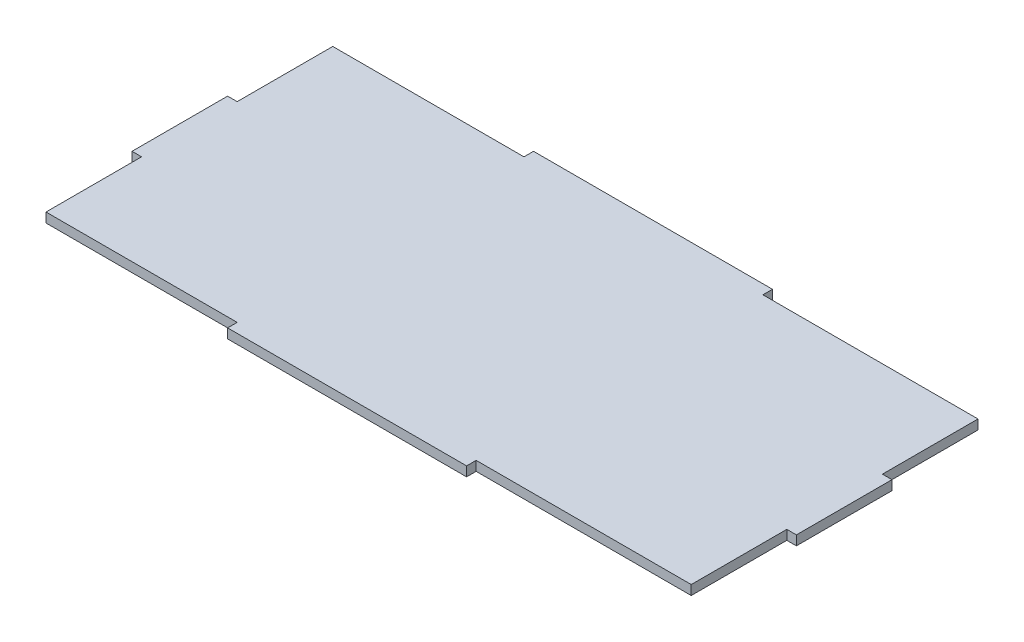
ISO-10303-21;
HEADER;
FILE_DESCRIPTION(('STEP AP214'),'2;1');
FILE_NAME('part.step','',(''),(''),'','','');
FILE_SCHEMA(('AUTOMOTIVE_DESIGN { 1 0 10303 214 1 1 1 1 }'));
ENDSEC;
DATA;
#1=APPLICATION_CONTEXT('core data for automotive mechanical design processes');
#2=APPLICATION_PROTOCOL_DEFINITION('international standard','automotive_design',2000,#1);
#3=PRODUCT_CONTEXT('',#1,'mechanical');
#4=PRODUCT('Part','Part','',(#3));
#5=PRODUCT_RELATED_PRODUCT_CATEGORY('part','',(#4));
#6=PRODUCT_DEFINITION_FORMATION('','',#4);
#7=PRODUCT_DEFINITION_CONTEXT('part definition',#1,'design');
#8=PRODUCT_DEFINITION('design','',#6,#7);
#9=PRODUCT_DEFINITION_SHAPE('','',#8);
#10=(LENGTH_UNIT() NAMED_UNIT(*) SI_UNIT(.MILLI.,.METRE.));
#11=(NAMED_UNIT(*) PLANE_ANGLE_UNIT() SI_UNIT($,.RADIAN.));
#12=(NAMED_UNIT(*) SI_UNIT($,.STERADIAN.) SOLID_ANGLE_UNIT());
#13=UNCERTAINTY_MEASURE_WITH_UNIT(LENGTH_MEASURE(1.E-05),#10,'distance_accuracy_value','');
#14=(GEOMETRIC_REPRESENTATION_CONTEXT(3) GLOBAL_UNCERTAINTY_ASSIGNED_CONTEXT((#13)) GLOBAL_UNIT_ASSIGNED_CONTEXT((#10,
#11,#12)) REPRESENTATION_CONTEXT('',''));
#15=CARTESIAN_POINT('',(0.,0.,0.));
#16=DIRECTION('',(0.,0.,1.));
#17=DIRECTION('',(1.,0.,0.));
#18=AXIS2_PLACEMENT_3D('',#15,#16,#17);
#19=CARTESIAN_POINT('',(-2.,2.,0.));
#20=DIRECTION('',(1.,0.,0.));
#21=DIRECTION('',(0.,0.,-1.));
#22=AXIS2_PLACEMENT_3D('',#19,#20,#21);
#23=PLANE('',#22);
#24=DIRECTION('',(0.,0.,1.));
#25=VECTOR('',#24,1.);
#26=CARTESIAN_POINT('',(-2.,0.,0.));
#27=LINE('',#26,#25);
#28=CARTESIAN_POINT('',(-2.,0.,-10.));
#29=VERTEX_POINT('',#28);
#30=CARTESIAN_POINT('',(-2.,0.,9.99999999999999));
#31=VERTEX_POINT('',#30);
#32=EDGE_CURVE('E353',#29,#31,#27,.T.);
#33=ORIENTED_EDGE('',*,*,#32,.T.);
#34=DIRECTION('',(0.,-1.,0.));
#35=VECTOR('',#34,1.);
#36=CARTESIAN_POINT('',(-2.,2.,9.99999999999999));
#37=LINE('',#36,#35);
#38=CARTESIAN_POINT('',(-2.,2.,9.99999999999999));
#39=VERTEX_POINT('',#38);
#40=EDGE_CURVE('E11',#39,#31,#37,.T.);
#41=ORIENTED_EDGE('',*,*,#40,.F.);
#42=DIRECTION('',(0.,0.,1.));
#43=VECTOR('',#42,1.);
#44=CARTESIAN_POINT('',(-2.,2.,0.));
#45=LINE('',#44,#43);
#46=CARTESIAN_POINT('',(-2.,2.,-10.));
#47=VERTEX_POINT('',#46);
#48=EDGE_CURVE('E269',#47,#39,#45,.T.);
#49=ORIENTED_EDGE('',*,*,#48,.F.);
#50=DIRECTION('',(0.,-1.,0.));
#51=VECTOR('',#50,1.);
#52=CARTESIAN_POINT('',(-2.,2.,-10.));
#53=LINE('',#52,#51);
#54=EDGE_CURVE('E62',#47,#29,#53,.T.);
#55=ORIENTED_EDGE('',*,*,#54,.T.);
#56=EDGE_LOOP('',(#33,#41,#49,#55));
#57=FACE_BOUND('',#56,.T.);
#58=ADVANCED_FACE('F45',(#57),#23,.F.);
#59=CARTESIAN_POINT('',(0.,2.,9.99999999999999));
#60=DIRECTION('',(0.,0.,-1.));
#61=DIRECTION('',(-1.,0.,0.));
#62=AXIS2_PLACEMENT_3D('',#59,#60,#61);
#63=PLANE('',#62);
#64=DIRECTION('',(1.,0.,0.));
#65=VECTOR('',#64,1.);
#66=CARTESIAN_POINT('',(0.,0.,9.99999999999999));
#67=LINE('',#66,#65);
#68=CARTESIAN_POINT('',(0.,0.,9.99999999999999));
#69=VERTEX_POINT('',#68);
#70=EDGE_CURVE('E344',#31,#69,#67,.T.);
#71=ORIENTED_EDGE('',*,*,#70,.T.);
#72=DIRECTION('',(0.,-1.,0.));
#73=VECTOR('',#72,1.);
#74=CARTESIAN_POINT('',(0.,2.,9.99999999999999));
#75=LINE('',#74,#73);
#76=CARTESIAN_POINT('',(0.,2.,9.99999999999999));
#77=VERTEX_POINT('',#76);
#78=EDGE_CURVE('E54',#77,#69,#75,.T.);
#79=ORIENTED_EDGE('',*,*,#78,.F.);
#80=DIRECTION('',(1.,0.,0.));
#81=VECTOR('',#80,1.);
#82=CARTESIAN_POINT('',(0.,2.,9.99999999999999));
#83=LINE('',#82,#81);
#84=EDGE_CURVE('E137',#39,#77,#83,.T.);
#85=ORIENTED_EDGE('',*,*,#84,.F.);
#86=ORIENTED_EDGE('',*,*,#40,.T.);
#87=EDGE_LOOP('',(#71,#79,#85,#86));
#88=FACE_BOUND('',#87,.T.);
#89=ADVANCED_FACE('F446',(#88),#63,.F.);
#90=CARTESIAN_POINT('',(0.,2.,0.));
#91=DIRECTION('',(1.,0.,0.));
#92=DIRECTION('',(0.,0.,-1.));
#93=AXIS2_PLACEMENT_3D('',#90,#91,#92);
#94=PLANE('',#93);
#95=DIRECTION('',(0.,0.,1.));
#96=VECTOR('',#95,1.);
#97=CARTESIAN_POINT('',(0.,0.,0.));
#98=LINE('',#97,#96);
#99=CARTESIAN_POINT('',(0.,0.,30.));
#100=VERTEX_POINT('',#99);
#101=EDGE_CURVE('E282',#69,#100,#98,.T.);
#102=ORIENTED_EDGE('',*,*,#101,.T.);
#103=DIRECTION('',(0.,-1.,0.));
#104=VECTOR('',#103,1.);
#105=CARTESIAN_POINT('',(0.,2.,30.));
#106=LINE('',#105,#104);
#107=CARTESIAN_POINT('',(0.,2.,30.));
#108=VERTEX_POINT('',#107);
#109=EDGE_CURVE('E334',#108,#100,#106,.T.);
#110=ORIENTED_EDGE('',*,*,#109,.F.);
#111=DIRECTION('',(0.,0.,1.));
#112=VECTOR('',#111,1.);
#113=CARTESIAN_POINT('',(0.,2.,0.));
#114=LINE('',#113,#112);
#115=EDGE_CURVE('E208',#77,#108,#114,.T.);
#116=ORIENTED_EDGE('',*,*,#115,.F.);
#117=ORIENTED_EDGE('',*,*,#78,.T.);
#118=EDGE_LOOP('',(#102,#110,#116,#117));
#119=FACE_BOUND('',#118,.T.);
#120=ADVANCED_FACE('F341',(#119),#94,.F.);
#121=CARTESIAN_POINT('',(0.,2.,30.));
#122=DIRECTION('',(0.,0.,-1.));
#123=DIRECTION('',(-1.,0.,0.));
#124=AXIS2_PLACEMENT_3D('',#121,#122,#123);
#125=PLANE('',#124);
#126=DIRECTION('',(1.,0.,0.));
#127=VECTOR('',#126,1.);
#128=CARTESIAN_POINT('',(0.,0.,30.));
#129=LINE('',#128,#127);
#130=CARTESIAN_POINT('',(40.,0.,30.));
#131=VERTEX_POINT('',#130);
#132=EDGE_CURVE('E346',#100,#131,#129,.T.);
#133=ORIENTED_EDGE('',*,*,#132,.T.);
#134=DIRECTION('',(0.,-1.,0.));
#135=VECTOR('',#134,1.);
#136=CARTESIAN_POINT('',(40.,2.,30.));
#137=LINE('',#136,#135);
#138=CARTESIAN_POINT('',(40.,2.,30.));
#139=VERTEX_POINT('',#138);
#140=EDGE_CURVE('E330',#139,#131,#137,.T.);
#141=ORIENTED_EDGE('',*,*,#140,.F.);
#142=DIRECTION('',(1.,0.,0.));
#143=VECTOR('',#142,1.);
#144=CARTESIAN_POINT('',(0.,2.,30.));
#145=LINE('',#144,#143);
#146=EDGE_CURVE('E252',#108,#139,#145,.T.);
#147=ORIENTED_EDGE('',*,*,#146,.F.);
#148=ORIENTED_EDGE('',*,*,#109,.T.);
#149=EDGE_LOOP('',(#133,#141,#147,#148));
#150=FACE_BOUND('',#149,.T.);
#151=ADVANCED_FACE('F485',(#150),#125,.F.);
#152=CARTESIAN_POINT('',(40.,2.,0.));
#153=DIRECTION('',(1.,0.,0.));
#154=DIRECTION('',(0.,0.,-1.));
#155=AXIS2_PLACEMENT_3D('',#152,#153,#154);
#156=PLANE('',#155);
#157=DIRECTION('',(0.,0.,1.));
#158=VECTOR('',#157,1.);
#159=CARTESIAN_POINT('',(40.,0.,0.));
#160=LINE('',#159,#158);
#161=CARTESIAN_POINT('',(40.,0.,32.));
#162=VERTEX_POINT('',#161);
#163=EDGE_CURVE('E350',#131,#162,#160,.T.);
#164=ORIENTED_EDGE('',*,*,#163,.T.);
#165=DIRECTION('',(0.,-1.,0.));
#166=VECTOR('',#165,1.);
#167=CARTESIAN_POINT('',(40.,2.,32.));
#168=LINE('',#167,#166);
#169=CARTESIAN_POINT('',(40.,2.,32.));
#170=VERTEX_POINT('',#169);
#171=EDGE_CURVE('E326',#170,#162,#168,.T.);
#172=ORIENTED_EDGE('',*,*,#171,.F.);
#173=DIRECTION('',(0.,0.,1.));
#174=VECTOR('',#173,1.);
#175=CARTESIAN_POINT('',(40.,2.,0.));
#176=LINE('',#175,#174);
#177=EDGE_CURVE('E261',#139,#170,#176,.T.);
#178=ORIENTED_EDGE('',*,*,#177,.F.);
#179=ORIENTED_EDGE('',*,*,#140,.T.);
#180=EDGE_LOOP('',(#164,#172,#178,#179));
#181=FACE_BOUND('',#180,.T.);
#182=ADVANCED_FACE('F493',(#181),#156,.F.);
#183=CARTESIAN_POINT('',(0.,2.,32.));
#184=DIRECTION('',(0.,0.,-1.));
#185=DIRECTION('',(-1.,0.,0.));
#186=AXIS2_PLACEMENT_3D('',#183,#184,#185);
#187=PLANE('',#186);
#188=DIRECTION('',(1.,0.,0.));
#189=VECTOR('',#188,1.);
#190=CARTESIAN_POINT('',(0.,0.,32.));
#191=LINE('',#190,#189);
#192=CARTESIAN_POINT('',(90.,0.,32.));
#193=VERTEX_POINT('',#192);
#194=EDGE_CURVE('E359',#162,#193,#191,.T.);
#195=ORIENTED_EDGE('',*,*,#194,.T.);
#196=DIRECTION('',(0.,-1.,0.));
#197=VECTOR('',#196,1.);
#198=CARTESIAN_POINT('',(90.,2.,32.));
#199=LINE('',#198,#197);
#200=CARTESIAN_POINT('',(90.,2.,32.));
#201=VERTEX_POINT('',#200);
#202=EDGE_CURVE('E323',#201,#193,#199,.T.);
#203=ORIENTED_EDGE('',*,*,#202,.F.);
#204=DIRECTION('',(1.,0.,0.));
#205=VECTOR('',#204,1.);
#206=CARTESIAN_POINT('',(0.,2.,32.));
#207=LINE('',#206,#205);
#208=EDGE_CURVE('E258',#170,#201,#207,.T.);
#209=ORIENTED_EDGE('',*,*,#208,.F.);
#210=ORIENTED_EDGE('',*,*,#171,.T.);
#211=EDGE_LOOP('',(#195,#203,#209,#210));
#212=FACE_BOUND('',#211,.T.);
#213=ADVANCED_FACE('F489',(#212),#187,.F.);
#214=CARTESIAN_POINT('',(90.,2.,0.));
#215=DIRECTION('',(1.,0.,0.));
#216=DIRECTION('',(0.,0.,-1.));
#217=AXIS2_PLACEMENT_3D('',#214,#215,#216);
#218=PLANE('',#217);
#219=DIRECTION('',(0.,0.,1.));
#220=VECTOR('',#219,1.);
#221=CARTESIAN_POINT('',(90.,0.,0.));
#222=LINE('',#221,#220);
#223=CARTESIAN_POINT('',(90.,0.,30.));
#224=VERTEX_POINT('',#223);
#225=EDGE_CURVE('E363',#224,#193,#222,.T.);
#226=ORIENTED_EDGE('',*,*,#225,.F.);
#227=DIRECTION('',(0.,-1.,0.));
#228=VECTOR('',#227,1.);
#229=CARTESIAN_POINT('',(90.,2.,30.));
#230=LINE('',#229,#228);
#231=CARTESIAN_POINT('',(90.,2.,30.));
#232=VERTEX_POINT('',#231);
#233=EDGE_CURVE('E320',#232,#224,#230,.T.);
#234=ORIENTED_EDGE('',*,*,#233,.F.);
#235=DIRECTION('',(0.,0.,1.));
#236=VECTOR('',#235,1.);
#237=CARTESIAN_POINT('',(90.,2.,0.));
#238=LINE('',#237,#236);
#239=EDGE_CURVE('E250',#232,#201,#238,.T.);
#240=ORIENTED_EDGE('',*,*,#239,.T.);
#241=ORIENTED_EDGE('',*,*,#202,.T.);
#242=EDGE_LOOP('',(#226,#234,#240,#241));
#243=FACE_BOUND('',#242,.T.);
#244=ADVANCED_FACE('F483',(#243),#218,.T.);
#245=CARTESIAN_POINT('',(135.,0.,30.));
#246=VERTEX_POINT('',#245);
#247=EDGE_CURVE('E352',#224,#246,#129,.T.);
#248=ORIENTED_EDGE('',*,*,#247,.T.);
#249=DIRECTION('',(0.,-1.,0.));
#250=VECTOR('',#249,1.);
#251=CARTESIAN_POINT('',(135.,2.,30.));
#252=LINE('',#251,#250);
#253=CARTESIAN_POINT('',(135.,2.,30.));
#254=VERTEX_POINT('',#253);
#255=EDGE_CURVE('E317',#254,#246,#252,.T.);
#256=ORIENTED_EDGE('',*,*,#255,.F.);
#257=EDGE_CURVE('E245',#232,#254,#145,.T.);
#258=ORIENTED_EDGE('',*,*,#257,.F.);
#259=ORIENTED_EDGE('',*,*,#233,.T.);
#260=EDGE_LOOP('',(#248,#256,#258,#259));
#261=FACE_BOUND('',#260,.T.);
#262=ADVANCED_FACE('F418',(#261),#125,.F.);
#263=CARTESIAN_POINT('',(135.,2.,0.));
#264=DIRECTION('',(1.,0.,0.));
#265=DIRECTION('',(0.,0.,-1.));
#266=AXIS2_PLACEMENT_3D('',#263,#264,#265);
#267=PLANE('',#266);
#268=DIRECTION('',(0.,0.,1.));
#269=VECTOR('',#268,1.);
#270=CARTESIAN_POINT('',(135.,0.,0.));
#271=LINE('',#270,#269);
#272=CARTESIAN_POINT('',(135.,0.,10.));
#273=VERTEX_POINT('',#272);
#274=EDGE_CURVE('E367',#273,#246,#271,.T.);
#275=ORIENTED_EDGE('',*,*,#274,.F.);
#276=DIRECTION('',(0.,-1.,0.));
#277=VECTOR('',#276,1.);
#278=CARTESIAN_POINT('',(135.,2.,10.));
#279=LINE('',#278,#277);
#280=CARTESIAN_POINT('',(135.,2.,10.));
#281=VERTEX_POINT('',#280);
#282=EDGE_CURVE('E314',#281,#273,#279,.T.);
#283=ORIENTED_EDGE('',*,*,#282,.F.);
#284=DIRECTION('',(0.,0.,1.));
#285=VECTOR('',#284,1.);
#286=CARTESIAN_POINT('',(135.,2.,0.));
#287=LINE('',#286,#285);
#288=EDGE_CURVE('E234',#281,#254,#287,.T.);
#289=ORIENTED_EDGE('',*,*,#288,.T.);
#290=ORIENTED_EDGE('',*,*,#255,.T.);
#291=EDGE_LOOP('',(#275,#283,#289,#290));
#292=FACE_BOUND('',#291,.T.);
#293=ADVANCED_FACE('F422',(#292),#267,.T.);
#294=CARTESIAN_POINT('',(0.,2.,10.));
#295=DIRECTION('',(0.,0.,-1.));
#296=DIRECTION('',(-1.,0.,0.));
#297=AXIS2_PLACEMENT_3D('',#294,#295,#296);
#298=PLANE('',#297);
#299=DIRECTION('',(1.,0.,0.));
#300=VECTOR('',#299,1.);
#301=CARTESIAN_POINT('',(0.,0.,10.));
#302=LINE('',#301,#300);
#303=CARTESIAN_POINT('',(137.,0.,10.));
#304=VERTEX_POINT('',#303);
#305=EDGE_CURVE('E371',#273,#304,#302,.T.);
#306=ORIENTED_EDGE('',*,*,#305,.T.);
#307=DIRECTION('',(0.,-1.,0.));
#308=VECTOR('',#307,1.);
#309=CARTESIAN_POINT('',(137.,2.,10.));
#310=LINE('',#309,#308);
#311=CARTESIAN_POINT('',(137.,2.,10.));
#312=VERTEX_POINT('',#311);
#313=EDGE_CURVE('E311',#312,#304,#310,.T.);
#314=ORIENTED_EDGE('',*,*,#313,.F.);
#315=DIRECTION('',(1.,0.,0.));
#316=VECTOR('',#315,1.);
#317=CARTESIAN_POINT('',(0.,2.,10.));
#318=LINE('',#317,#316);
#319=EDGE_CURVE('E244',#281,#312,#318,.T.);
#320=ORIENTED_EDGE('',*,*,#319,.F.);
#321=ORIENTED_EDGE('',*,*,#282,.T.);
#322=EDGE_LOOP('',(#306,#314,#320,#321));
#323=FACE_BOUND('',#322,.T.);
#324=ADVANCED_FACE('F426',(#323),#298,.F.);
#325=CARTESIAN_POINT('',(137.,2.,-1.90125692967058E-13));
#326=DIRECTION('',(1.,0.,0.));
#327=DIRECTION('',(0.,0.,-1.));
#328=AXIS2_PLACEMENT_3D('',#325,#326,#327);
#329=PLANE('',#328);
#330=DIRECTION('',(0.,0.,1.));
#331=VECTOR('',#330,1.);
#332=CARTESIAN_POINT('',(137.,0.,-1.90125692967058E-13));
#333=LINE('',#332,#331);
#334=CARTESIAN_POINT('',(137.,0.,-10.));
#335=VERTEX_POINT('',#334);
#336=EDGE_CURVE('E376',#335,#304,#333,.T.);
#337=ORIENTED_EDGE('',*,*,#336,.F.);
#338=DIRECTION('',(0.,-1.,0.));
#339=VECTOR('',#338,1.);
#340=CARTESIAN_POINT('',(137.,2.,-10.));
#341=LINE('',#340,#339);
#342=CARTESIAN_POINT('',(137.,2.,-10.));
#343=VERTEX_POINT('',#342);
#344=EDGE_CURVE('E308',#343,#335,#341,.T.);
#345=ORIENTED_EDGE('',*,*,#344,.F.);
#346=DIRECTION('',(0.,0.,1.));
#347=VECTOR('',#346,1.);
#348=CARTESIAN_POINT('',(137.,2.,-1.90125692967058E-13));
#349=LINE('',#348,#347);
#350=EDGE_CURVE('E239',#343,#312,#349,.T.);
#351=ORIENTED_EDGE('',*,*,#350,.T.);
#352=ORIENTED_EDGE('',*,*,#313,.T.);
#353=EDGE_LOOP('',(#337,#345,#351,#352));
#354=FACE_BOUND('',#353,.T.);
#355=ADVANCED_FACE('F436',(#354),#329,.T.);
#356=CARTESIAN_POINT('',(0.,2.,-9.99999999999988));
#357=DIRECTION('',(0.,0.,-1.));
#358=DIRECTION('',(-1.,0.,0.));
#359=AXIS2_PLACEMENT_3D('',#356,#357,#358);
#360=PLANE('',#359);
#361=DIRECTION('',(1.,0.,0.));
#362=VECTOR('',#361,1.);
#363=CARTESIAN_POINT('',(0.,0.,-9.99999999999988));
#364=LINE('',#363,#362);
#365=CARTESIAN_POINT('',(135.,0.,-10.));
#366=VERTEX_POINT('',#365);
#367=EDGE_CURVE('E380',#366,#335,#364,.T.);
#368=ORIENTED_EDGE('',*,*,#367,.F.);
#369=DIRECTION('',(0.,-1.,0.));
#370=VECTOR('',#369,1.);
#371=CARTESIAN_POINT('',(135.,2.,-10.));
#372=LINE('',#371,#370);
#373=CARTESIAN_POINT('',(135.,2.,-10.));
#374=VERTEX_POINT('',#373);
#375=EDGE_CURVE('E305',#374,#366,#372,.T.);
#376=ORIENTED_EDGE('',*,*,#375,.F.);
#377=DIRECTION('',(1.,0.,0.));
#378=VECTOR('',#377,1.);
#379=CARTESIAN_POINT('',(0.,2.,-9.99999999999988));
#380=LINE('',#379,#378);
#381=EDGE_CURVE('E232',#374,#343,#380,.T.);
#382=ORIENTED_EDGE('',*,*,#381,.T.);
#383=ORIENTED_EDGE('',*,*,#344,.T.);
#384=EDGE_LOOP('',(#368,#376,#382,#383));
#385=FACE_BOUND('',#384,.T.);
#386=ADVANCED_FACE('F434',(#385),#360,.T.);
#387=CARTESIAN_POINT('',(135.,0.,-30.));
#388=VERTEX_POINT('',#387);
#389=EDGE_CURVE('E372',#388,#366,#271,.T.);
#390=ORIENTED_EDGE('',*,*,#389,.F.);
#391=DIRECTION('',(0.,-1.,0.));
#392=VECTOR('',#391,1.);
#393=CARTESIAN_POINT('',(135.,2.,-30.));
#394=LINE('',#393,#392);
#395=CARTESIAN_POINT('',(135.,2.,-30.));
#396=VERTEX_POINT('',#395);
#397=EDGE_CURVE('E302',#396,#388,#394,.T.);
#398=ORIENTED_EDGE('',*,*,#397,.F.);
#399=EDGE_CURVE('E225',#396,#374,#287,.T.);
#400=ORIENTED_EDGE('',*,*,#399,.T.);
#401=ORIENTED_EDGE('',*,*,#375,.T.);
#402=EDGE_LOOP('',(#390,#398,#400,#401));
#403=FACE_BOUND('',#402,.T.);
#404=ADVANCED_FACE('F411',(#403),#267,.T.);
#405=CARTESIAN_POINT('',(0.,2.,-30.));
#406=DIRECTION('',(0.,0.,-1.));
#407=DIRECTION('',(-1.,0.,0.));
#408=AXIS2_PLACEMENT_3D('',#405,#406,#407);
#409=PLANE('',#408);
#410=DIRECTION('',(1.,0.,0.));
#411=VECTOR('',#410,1.);
#412=CARTESIAN_POINT('',(0.,0.,-30.));
#413=LINE('',#412,#411);
#414=CARTESIAN_POINT('',(90.,0.,-30.));
#415=VERTEX_POINT('',#414);
#416=EDGE_CURVE('E384',#415,#388,#413,.T.);
#417=ORIENTED_EDGE('',*,*,#416,.F.);
#418=DIRECTION('',(0.,-1.,0.));
#419=VECTOR('',#418,1.);
#420=CARTESIAN_POINT('',(90.,2.,-30.));
#421=LINE('',#420,#419);
#422=CARTESIAN_POINT('',(90.,2.,-30.));
#423=VERTEX_POINT('',#422);
#424=EDGE_CURVE('E299',#423,#415,#421,.T.);
#425=ORIENTED_EDGE('',*,*,#424,.F.);
#426=DIRECTION('',(1.,0.,0.));
#427=VECTOR('',#426,1.);
#428=CARTESIAN_POINT('',(0.,2.,-30.));
#429=LINE('',#428,#427);
#430=EDGE_CURVE('E216',#423,#396,#429,.T.);
#431=ORIENTED_EDGE('',*,*,#430,.T.);
#432=ORIENTED_EDGE('',*,*,#397,.T.);
#433=EDGE_LOOP('',(#417,#425,#431,#432));
#434=FACE_BOUND('',#433,.T.);
#435=ADVANCED_FACE('F410',(#434),#409,.T.);
#436=CARTESIAN_POINT('',(90.,2.,0.));
#437=DIRECTION('',(1.,0.,0.));
#438=DIRECTION('',(0.,0.,-1.));
#439=AXIS2_PLACEMENT_3D('',#436,#437,#438);
#440=PLANE('',#439);
#441=DIRECTION('',(0.,0.,1.));
#442=VECTOR('',#441,1.);
#443=CARTESIAN_POINT('',(90.,0.,0.));
#444=LINE('',#443,#442);
#445=CARTESIAN_POINT('',(90.,0.,-32.));
#446=VERTEX_POINT('',#445);
#447=EDGE_CURVE('E388',#446,#415,#444,.T.);
#448=ORIENTED_EDGE('',*,*,#447,.F.);
#449=DIRECTION('',(0.,-1.,0.));
#450=VECTOR('',#449,1.);
#451=CARTESIAN_POINT('',(90.,2.,-32.));
#452=LINE('',#451,#450);
#453=CARTESIAN_POINT('',(90.,2.,-32.));
#454=VERTEX_POINT('',#453);
#455=EDGE_CURVE('E296',#454,#446,#452,.T.);
#456=ORIENTED_EDGE('',*,*,#455,.F.);
#457=DIRECTION('',(0.,0.,1.));
#458=VECTOR('',#457,1.);
#459=CARTESIAN_POINT('',(90.,2.,0.));
#460=LINE('',#459,#458);
#461=EDGE_CURVE('E224',#454,#423,#460,.T.);
#462=ORIENTED_EDGE('',*,*,#461,.T.);
#463=ORIENTED_EDGE('',*,*,#424,.T.);
#464=EDGE_LOOP('',(#448,#456,#462,#463));
#465=FACE_BOUND('',#464,.T.);
#466=ADVANCED_FACE('F406',(#465),#440,.T.);
#467=CARTESIAN_POINT('',(0.,2.,-32.));
#468=DIRECTION('',(0.,0.,-1.));
#469=DIRECTION('',(-1.,0.,0.));
#470=AXIS2_PLACEMENT_3D('',#467,#468,#469);
#471=PLANE('',#470);
#472=DIRECTION('',(1.,0.,0.));
#473=VECTOR('',#472,1.);
#474=CARTESIAN_POINT('',(0.,0.,-32.));
#475=LINE('',#474,#473);
#476=CARTESIAN_POINT('',(40.,0.,-32.));
#477=VERTEX_POINT('',#476);
#478=EDGE_CURVE('E391',#477,#446,#475,.T.);
#479=ORIENTED_EDGE('',*,*,#478,.F.);
#480=DIRECTION('',(0.,-1.,0.));
#481=VECTOR('',#480,1.);
#482=CARTESIAN_POINT('',(40.,2.,-32.));
#483=LINE('',#482,#481);
#484=CARTESIAN_POINT('',(40.,2.,-32.));
#485=VERTEX_POINT('',#484);
#486=EDGE_CURVE('E293',#485,#477,#483,.T.);
#487=ORIENTED_EDGE('',*,*,#486,.F.);
#488=DIRECTION('',(1.,0.,0.));
#489=VECTOR('',#488,1.);
#490=CARTESIAN_POINT('',(0.,2.,-32.));
#491=LINE('',#490,#489);
#492=EDGE_CURVE('E218',#485,#454,#491,.T.);
#493=ORIENTED_EDGE('',*,*,#492,.T.);
#494=ORIENTED_EDGE('',*,*,#455,.T.);
#495=EDGE_LOOP('',(#479,#487,#493,#494));
#496=FACE_BOUND('',#495,.T.);
#497=ADVANCED_FACE('F401',(#496),#471,.T.);
#498=CARTESIAN_POINT('',(40.,2.,0.));
#499=DIRECTION('',(1.,0.,0.));
#500=DIRECTION('',(0.,0.,-1.));
#501=AXIS2_PLACEMENT_3D('',#498,#499,#500);
#502=PLANE('',#501);
#503=DIRECTION('',(0.,0.,1.));
#504=VECTOR('',#503,1.);
#505=CARTESIAN_POINT('',(40.,0.,0.));
#506=LINE('',#505,#504);
#507=CARTESIAN_POINT('',(40.,0.,-30.));
#508=VERTEX_POINT('',#507);
#509=EDGE_CURVE('E285',#477,#508,#506,.T.);
#510=ORIENTED_EDGE('',*,*,#509,.T.);
#511=DIRECTION('',(0.,-1.,0.));
#512=VECTOR('',#511,1.);
#513=CARTESIAN_POINT('',(40.,2.,-30.));
#514=LINE('',#513,#512);
#515=CARTESIAN_POINT('',(40.,2.,-30.));
#516=VERTEX_POINT('',#515);
#517=EDGE_CURVE('E199',#516,#508,#514,.T.);
#518=ORIENTED_EDGE('',*,*,#517,.F.);
#519=DIRECTION('',(0.,0.,1.));
#520=VECTOR('',#519,1.);
#521=CARTESIAN_POINT('',(40.,2.,0.));
#522=LINE('',#521,#520);
#523=EDGE_CURVE('E212',#485,#516,#522,.T.);
#524=ORIENTED_EDGE('',*,*,#523,.F.);
#525=ORIENTED_EDGE('',*,*,#486,.T.);
#526=EDGE_LOOP('',(#510,#518,#524,#525));
#527=FACE_BOUND('',#526,.T.);
#528=ADVANCED_FACE('F468',(#527),#502,.F.);
#529=CARTESIAN_POINT('',(0.,0.,-30.));
#530=VERTEX_POINT('',#529);
#531=EDGE_CURVE('E195',#530,#508,#413,.T.);
#532=ORIENTED_EDGE('',*,*,#531,.F.);
#533=DIRECTION('',(0.,-1.,0.));
#534=VECTOR('',#533,1.);
#535=CARTESIAN_POINT('',(0.,2.,-30.));
#536=LINE('',#535,#534);
#537=CARTESIAN_POINT('',(0.,2.,-30.));
#538=VERTEX_POINT('',#537);
#539=EDGE_CURVE('E189',#538,#530,#536,.T.);
#540=ORIENTED_EDGE('',*,*,#539,.F.);
#541=EDGE_CURVE('E193',#538,#516,#429,.T.);
#542=ORIENTED_EDGE('',*,*,#541,.T.);
#543=ORIENTED_EDGE('',*,*,#517,.T.);
#544=EDGE_LOOP('',(#532,#540,#542,#543));
#545=FACE_BOUND('',#544,.T.);
#546=ADVANCED_FACE('F191',(#545),#409,.T.);
#547=CARTESIAN_POINT('',(0.,0.,-10.));
#548=VERTEX_POINT('',#547);
#549=EDGE_CURVE('E277',#530,#548,#98,.T.);
#550=ORIENTED_EDGE('',*,*,#549,.T.);
#551=DIRECTION('',(0.,-1.,0.));
#552=VECTOR('',#551,1.);
#553=CARTESIAN_POINT('',(0.,2.,-10.));
#554=LINE('',#553,#552);
#555=CARTESIAN_POINT('',(0.,2.,-10.));
#556=VERTEX_POINT('',#555);
#557=EDGE_CURVE('E125',#556,#548,#554,.T.);
#558=ORIENTED_EDGE('',*,*,#557,.F.);
#559=EDGE_CURVE('E201',#538,#556,#114,.T.);
#560=ORIENTED_EDGE('',*,*,#559,.F.);
#561=ORIENTED_EDGE('',*,*,#539,.T.);
#562=EDGE_LOOP('',(#550,#558,#560,#561));
#563=FACE_BOUND('',#562,.T.);
#564=ADVANCED_FACE('F202',(#563),#94,.F.);
#565=CARTESIAN_POINT('',(0.,2.,-10.));
#566=DIRECTION('',(0.,0.,-1.));
#567=DIRECTION('',(-1.,0.,0.));
#568=AXIS2_PLACEMENT_3D('',#565,#566,#567);
#569=PLANE('',#568);
#570=DIRECTION('',(1.,0.,0.));
#571=VECTOR('',#570,1.);
#572=CARTESIAN_POINT('',(0.,0.,-10.));
#573=LINE('',#572,#571);
#574=EDGE_CURVE('E273',#29,#548,#573,.T.);
#575=ORIENTED_EDGE('',*,*,#574,.F.);
#576=ORIENTED_EDGE('',*,*,#54,.F.);
#577=DIRECTION('',(1.,0.,0.));
#578=VECTOR('',#577,1.);
#579=CARTESIAN_POINT('',(0.,2.,-10.));
#580=LINE('',#579,#578);
#581=EDGE_CURVE('E206',#47,#556,#580,.T.);
#582=ORIENTED_EDGE('',*,*,#581,.T.);
#583=ORIENTED_EDGE('',*,*,#557,.T.);
#584=EDGE_LOOP('',(#575,#576,#582,#583));
#585=FACE_BOUND('',#584,.T.);
#586=ADVANCED_FACE('F455',(#585),#569,.T.);
#587=CARTESIAN_POINT('',(0.,2.,0.));
#588=DIRECTION('',(0.,1.,0.));
#589=DIRECTION('',(0.,0.,1.));
#590=AXIS2_PLACEMENT_3D('',#587,#588,#589);
#591=PLANE('',#590);
#592=ORIENTED_EDGE('',*,*,#48,.T.);
#593=ORIENTED_EDGE('',*,*,#84,.T.);
#594=ORIENTED_EDGE('',*,*,#115,.T.);
#595=ORIENTED_EDGE('',*,*,#146,.T.);
#596=ORIENTED_EDGE('',*,*,#177,.T.);
#597=ORIENTED_EDGE('',*,*,#208,.T.);
#598=ORIENTED_EDGE('',*,*,#239,.F.);
#599=ORIENTED_EDGE('',*,*,#257,.T.);
#600=ORIENTED_EDGE('',*,*,#288,.F.);
#601=ORIENTED_EDGE('',*,*,#319,.T.);
#602=ORIENTED_EDGE('',*,*,#350,.F.);
#603=ORIENTED_EDGE('',*,*,#381,.F.);
#604=ORIENTED_EDGE('',*,*,#399,.F.);
#605=ORIENTED_EDGE('',*,*,#430,.F.);
#606=ORIENTED_EDGE('',*,*,#461,.F.);
#607=ORIENTED_EDGE('',*,*,#492,.F.);
#608=ORIENTED_EDGE('',*,*,#523,.T.);
#609=ORIENTED_EDGE('',*,*,#541,.F.);
#610=ORIENTED_EDGE('',*,*,#559,.T.);
#611=ORIENTED_EDGE('',*,*,#581,.F.);
#612=EDGE_LOOP('',(#592,#593,#594,#595,#596,#597,#598,#599,#600,#601,#602,#603,#604,#605,#606,
#607,#608,#609,#610,#611));
#613=FACE_BOUND('',#612,.T.);
#614=ADVANCED_FACE('F209',(#613),#591,.T.);
#615=CARTESIAN_POINT('',(0.,0.,0.));
#616=DIRECTION('',(0.,1.,0.));
#617=DIRECTION('',(0.,0.,1.));
#618=AXIS2_PLACEMENT_3D('',#615,#616,#617);
#619=PLANE('',#618);
#620=ORIENTED_EDGE('',*,*,#32,.F.);
#621=ORIENTED_EDGE('',*,*,#574,.T.);
#622=ORIENTED_EDGE('',*,*,#549,.F.);
#623=ORIENTED_EDGE('',*,*,#531,.T.);
#624=ORIENTED_EDGE('',*,*,#509,.F.);
#625=ORIENTED_EDGE('',*,*,#478,.T.);
#626=ORIENTED_EDGE('',*,*,#447,.T.);
#627=ORIENTED_EDGE('',*,*,#416,.T.);
#628=ORIENTED_EDGE('',*,*,#389,.T.);
#629=ORIENTED_EDGE('',*,*,#367,.T.);
#630=ORIENTED_EDGE('',*,*,#336,.T.);
#631=ORIENTED_EDGE('',*,*,#305,.F.);
#632=ORIENTED_EDGE('',*,*,#274,.T.);
#633=ORIENTED_EDGE('',*,*,#247,.F.);
#634=ORIENTED_EDGE('',*,*,#225,.T.);
#635=ORIENTED_EDGE('',*,*,#194,.F.);
#636=ORIENTED_EDGE('',*,*,#163,.F.);
#637=ORIENTED_EDGE('',*,*,#132,.F.);
#638=ORIENTED_EDGE('',*,*,#101,.F.);
#639=ORIENTED_EDGE('',*,*,#70,.F.);
#640=EDGE_LOOP('',(#620,#621,#622,#623,#624,#625,#626,#627,#628,#629,#630,#631,#632,#633,#634,
#635,#636,#637,#638,#639));
#641=FACE_BOUND('',#640,.T.);
#642=ADVANCED_FACE('F343',(#641),#619,.F.);
#643=CLOSED_SHELL('',(#58,#89,#120,#151,#182,#213,#244,#262,#293,#324,#355,#386,#404,#435,#466,
#497,#528,#546,#564,#586,#614,#642));
#644=MANIFOLD_SOLID_BREP('B2',#643);
#645=ADVANCED_BREP_SHAPE_REPRESENTATION('',(#18,#644),#14);
#646=SHAPE_DEFINITION_REPRESENTATION(#9,#645);
ENDSEC;
END-ISO-10303-21;
